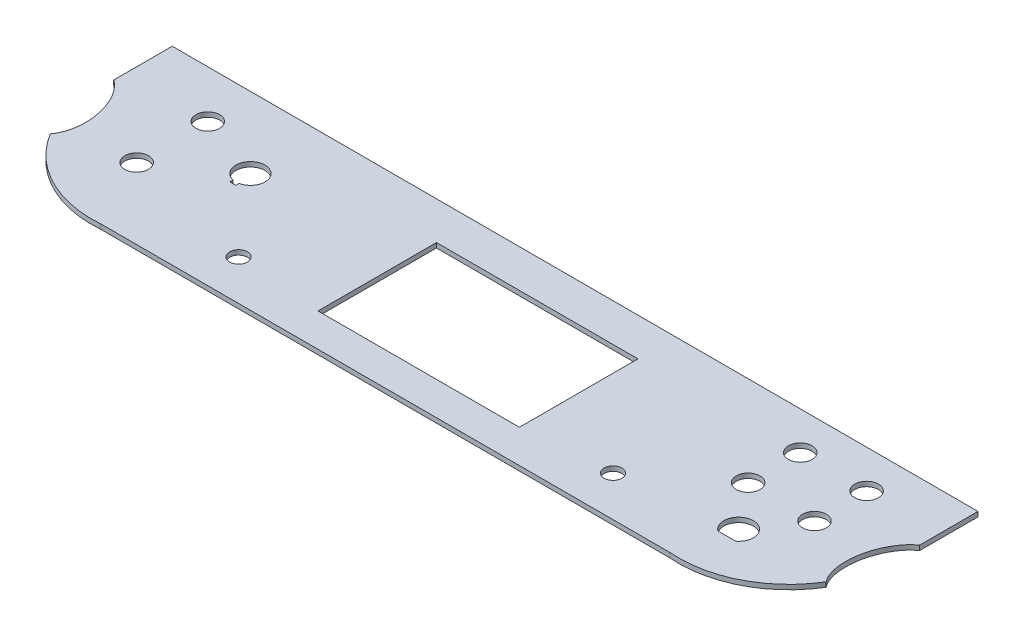
ISO-10303-21;
HEADER;
FILE_DESCRIPTION(('STEP AP214'),'2;1');
FILE_NAME('part.step','',(''),(''),'','','');
FILE_SCHEMA(('AUTOMOTIVE_DESIGN { 1 0 10303 214 1 1 1 1 }'));
ENDSEC;
DATA;
#1=APPLICATION_CONTEXT('core data for automotive mechanical design processes');
#2=APPLICATION_PROTOCOL_DEFINITION('international standard','automotive_design',2000,#1);
#3=PRODUCT_CONTEXT('',#1,'mechanical');
#4=PRODUCT('Part','Part','',(#3));
#5=PRODUCT_RELATED_PRODUCT_CATEGORY('part','',(#4));
#6=PRODUCT_DEFINITION_FORMATION('','',#4);
#7=PRODUCT_DEFINITION_CONTEXT('part definition',#1,'design');
#8=PRODUCT_DEFINITION('design','',#6,#7);
#9=PRODUCT_DEFINITION_SHAPE('','',#8);
#10=(LENGTH_UNIT() NAMED_UNIT(*) SI_UNIT(.MILLI.,.METRE.));
#11=(NAMED_UNIT(*) PLANE_ANGLE_UNIT() SI_UNIT($,.RADIAN.));
#12=(NAMED_UNIT(*) SI_UNIT($,.STERADIAN.) SOLID_ANGLE_UNIT());
#13=UNCERTAINTY_MEASURE_WITH_UNIT(LENGTH_MEASURE(1.E-05),#10,'distance_accuracy_value','');
#14=(GEOMETRIC_REPRESENTATION_CONTEXT(3) GLOBAL_UNCERTAINTY_ASSIGNED_CONTEXT((#13)) GLOBAL_UNIT_ASSIGNED_CONTEXT((#10,
#11,#12)) REPRESENTATION_CONTEXT('',''));
#15=CARTESIAN_POINT('',(0.,0.,0.));
#16=DIRECTION('',(0.,0.,1.));
#17=DIRECTION('',(1.,0.,0.));
#18=AXIS2_PLACEMENT_3D('',#15,#16,#17);
#19=CARTESIAN_POINT('',(157.295067766693,2.54,6.44379470696514));
#20=DIRECTION('',(0.,-1.,0.));
#21=DIRECTION('',(0.,0.,-1.));
#22=AXIS2_PLACEMENT_3D('',#19,#20,#21);
#23=PLANE('',#22);
#24=CARTESIAN_POINT('',(176.53,2.54,-15.8675400014012));
#25=DIRECTION('',(0.,1.,0.));
#26=DIRECTION('',(0.,0.,1.));
#27=AXIS2_PLACEMENT_3D('',#24,#25,#26);
#28=CIRCLE('',#27,6.35);
#29=CARTESIAN_POINT('',(176.53,2.54,-9.51754000140121));
#30=VERTEX_POINT('',#29);
#31=EDGE_CURVE('E222',#30,#30,#28,.T.);
#32=ORIENTED_EDGE('',*,*,#31,.F.);
#33=EDGE_LOOP('',(#32));
#34=FACE_BOUND('',#33,.T.);
#35=CARTESIAN_POINT('',(100.33,2.54,43.8224599985988));
#36=DIRECTION('',(0.,1.,0.));
#37=DIRECTION('',(0.,0.,1.));
#38=AXIS2_PLACEMENT_3D('',#35,#36,#37);
#39=CIRCLE('',#38,4.7625);
#40=CARTESIAN_POINT('',(100.33,2.54,48.5849599985988));
#41=VERTEX_POINT('',#40);
#42=EDGE_CURVE('E209',#41,#41,#39,.T.);
#43=ORIENTED_EDGE('',*,*,#42,.F.);
#44=EDGE_LOOP('',(#43));
#45=FACE_BOUND('',#44,.T.);
#46=CARTESIAN_POINT('',(140.97,2.54,-15.8675400014012));
#47=DIRECTION('',(0.,1.,0.));
#48=DIRECTION('',(0.,0.,1.));
#49=AXIS2_PLACEMENT_3D('',#46,#47,#48);
#50=CIRCLE('',#49,6.35);
#51=CARTESIAN_POINT('',(140.97,2.54,-9.51754000140121));
#52=VERTEX_POINT('',#51);
#53=EDGE_CURVE('E236',#52,#52,#50,.T.);
#54=ORIENTED_EDGE('',*,*,#53,.F.);
#55=EDGE_LOOP('',(#54));
#56=FACE_BOUND('',#55,.T.);
#57=CARTESIAN_POINT('',(140.97,2.54,12.0724599985988));
#58=DIRECTION('',(0.,1.,0.));
#59=DIRECTION('',(0.,0.,1.));
#60=AXIS2_PLACEMENT_3D('',#57,#58,#59);
#61=CIRCLE('',#60,6.35);
#62=CARTESIAN_POINT('',(140.97,2.54,18.4224599985988));
#63=VERTEX_POINT('',#62);
#64=EDGE_CURVE('E210',#63,#63,#61,.T.);
#65=ORIENTED_EDGE('',*,*,#64,.F.);
#66=EDGE_LOOP('',(#65));
#67=FACE_BOUND('',#66,.T.);
#68=DIRECTION('',(-1.,0.,0.));
#69=VECTOR('',#68,1.);
#70=CARTESIAN_POINT('',(164.7825,2.54,42.5524599985988));
#71=LINE('',#70,#69);
#72=CARTESIAN_POINT('',(164.7825,2.54,42.5524599985988));
#73=VERTEX_POINT('',#72);
#74=CARTESIAN_POINT('',(155.2575,2.54,42.5524599985988));
#75=VERTEX_POINT('',#74);
#76=EDGE_CURVE('E223',#73,#75,#71,.T.);
#77=ORIENTED_EDGE('',*,*,#76,.T.);
#78=CARTESIAN_POINT('',(160.02,2.54,36.2024599985988));
#79=DIRECTION('',(0.,1.,0.));
#80=DIRECTION('',(0.,0.,1.));
#81=AXIS2_PLACEMENT_3D('',#78,#79,#80);
#82=CIRCLE('',#81,7.9375);
#83=EDGE_CURVE('E50',#73,#75,#82,.T.);
#84=ORIENTED_EDGE('',*,*,#83,.F.);
#85=EDGE_LOOP('',(#77,#84));
#86=FACE_BOUND('',#85,.T.);
#87=CARTESIAN_POINT('',(-100.33,2.54,43.8224599985988));
#88=DIRECTION('',(0.,1.,0.));
#89=DIRECTION('',(0.,0.,1.));
#90=AXIS2_PLACEMENT_3D('',#87,#88,#89);
#91=CIRCLE('',#90,4.7625);
#92=CARTESIAN_POINT('',(-100.33,2.54,48.5849599985988));
#93=VERTEX_POINT('',#92);
#94=EDGE_CURVE('E203',#93,#93,#91,.T.);
#95=ORIENTED_EDGE('',*,*,#94,.F.);
#96=EDGE_LOOP('',(#95));
#97=FACE_BOUND('',#96,.T.);
#98=CARTESIAN_POINT('',(-171.45,2.54,27.3124599985988));
#99=DIRECTION('',(0.,1.,0.));
#100=DIRECTION('',(0.,0.,1.));
#101=AXIS2_PLACEMENT_3D('',#98,#99,#100);
#102=CIRCLE('',#101,6.35);
#103=CARTESIAN_POINT('',(-171.45,2.54,33.6624599985988));
#104=VERTEX_POINT('',#103);
#105=EDGE_CURVE('E196',#104,#104,#102,.T.);
#106=ORIENTED_EDGE('',*,*,#105,.F.);
#107=EDGE_LOOP('',(#106));
#108=FACE_BOUND('',#107,.T.);
#109=CARTESIAN_POINT('',(214.418027538609,2.54,41.5587815019127));
#110=CARTESIAN_POINT('',(214.042953761031,2.54,41.4701865422102));
#111=CARTESIAN_POINT('',(213.302178044824,2.54,41.253320200473));
#112=CARTESIAN_POINT('',(211.76152730083,2.54,40.6070019163065));
#113=CARTESIAN_POINT('',(209.825715205948,2.54,39.3668951597452));
#114=CARTESIAN_POINT('',(207.642778210324,2.54,37.0782440730854));
#115=CARTESIAN_POINT('',(205.769429419578,2.54,33.9247631860474));
#116=CARTESIAN_POINT('',(204.364219868055,2.54,29.8685261295306));
#117=CARTESIAN_POINT('',(203.602011313652,2.54,24.951147017466));
#118=CARTESIAN_POINT('',(203.646262202064,2.54,19.3690889994743));
#119=CARTESIAN_POINT('',(204.584578871518,2.54,13.4996010852786));
#120=CARTESIAN_POINT('',(206.371728131496,2.54,7.8306131624101));
#121=CARTESIAN_POINT('',(208.829838854301,2.54,2.81872514173565));
#122=CARTESIAN_POINT('',(211.711764264887,2.54,-1.23788491346954));
#123=CARTESIAN_POINT('',(214.783414722827,2.54,-4.23665739676846));
#124=CARTESIAN_POINT('',(217.869789499089,2.54,-6.21861807679074));
#125=CARTESIAN_POINT('',(220.846064988478,2.54,-7.2886283265533));
#126=CARTESIAN_POINT('',(223.132164490552,2.54,-7.53149104698141));
#127=CARTESIAN_POINT('',(224.799177514851,2.54,-7.42013748288939));
#128=CARTESIAN_POINT('',(225.938456606011,2.54,-7.21386723727985));
#129=CARTESIAN_POINT('',(227.049620180322,2.54,-6.8885677246742));
#130=CARTESIAN_POINT('',(228.590270924316,2.54,-6.24224944050763));
#131=CARTESIAN_POINT('',(230.526083019198,2.54,-5.00214268394637));
#132=CARTESIAN_POINT('',(232.709020014821,2.54,-2.71349159728655));
#133=CARTESIAN_POINT('',(234.582368805567,2.54,0.439989289751422));
#134=CARTESIAN_POINT('',(235.98757835709,2.54,4.49622634626828));
#135=CARTESIAN_POINT('',(236.749786911493,2.54,9.41360545833282));
#136=CARTESIAN_POINT('',(236.705536023082,2.54,14.9956634763246));
#137=CARTESIAN_POINT('',(235.767219353627,2.54,20.8651513905202));
#138=CARTESIAN_POINT('',(233.98007009365,2.54,26.5341393133887));
#139=CARTESIAN_POINT('',(231.521959370844,2.54,31.5460273340632));
#140=CARTESIAN_POINT('',(228.640033960258,2.54,35.6026373892684));
#141=CARTESIAN_POINT('',(225.568383502318,2.54,38.6014098725673));
#142=CARTESIAN_POINT('',(222.482008726056,2.54,40.5833705525896));
#143=CARTESIAN_POINT('',(219.505733236668,2.54,41.6533808023522));
#144=CARTESIAN_POINT('',(217.219633734593,2.54,41.8962435227803));
#145=CARTESIAN_POINT('',(215.552620710294,2.54,41.7848899586882));
#146=CARTESIAN_POINT('',(214.793101316188,2.54,41.6473764616152));
#147=CARTESIAN_POINT('',(214.418027538609,2.54,41.5587815019127));
#148=B_SPLINE_CURVE_WITH_KNOTS('',3,(#109,#110,#111,#112,#113,#114,#115,#116,#117,#118,#119,
#120,#121,#122,#123,#124,#125,#126,#127,#128,#129,#130,#131,#132,#133,#134,#135,#136,#137,#138,
#139,#140,#141,#142,#143,#144,#145,#146,#147),.UNSPECIFIED.,.T.,.F.,(4,1,1,1,1,1,1,1,1,1,1,1,1,
1,1,1,1,1,1,1,1,1,1,1,1,1,1,1,1,1,1,1,1,1,1,1,4),(0.,0.015625,0.03125,0.0625,0.09375,0.125,
0.15625,0.1875,0.21875,0.25,0.28125,0.3125,0.34375,0.375,0.40625,0.4375,0.46875,0.484375,0.5,
0.515625,0.53125,0.5625,0.59375,0.625,0.65625,0.6875,0.71875,0.75,0.78125,0.8125,0.84375,0.875,
0.90625,0.9375,0.96875,0.984375,1.),.UNSPECIFIED.);
#149=CARTESIAN_POINT('',(207.868044886352,2.54,37.162504965888));
#150=VERTEX_POINT('',#149);
#151=CARTESIAN_POINT('',(215.9,2.54,-4.90259604492799));
#152=VERTEX_POINT('',#151);
#153=EDGE_CURVE('E260',#150,#152,#148,.T.);
#154=ORIENTED_EDGE('',*,*,#153,.T.);
#155=DIRECTION('',(0.,0.,-1.));
#156=VECTOR('',#155,1.);
#157=CARTESIAN_POINT('',(215.9,2.54,14.6124599985988));
#158=LINE('',#157,#156);
#159=CARTESIAN_POINT('',(215.9,2.54,-36.1875400014012));
#160=VERTEX_POINT('',#159);
#161=EDGE_CURVE('E341',#152,#160,#158,.T.);
#162=ORIENTED_EDGE('',*,*,#161,.T.);
#163=DIRECTION('',(-1.,0.,0.));
#164=VECTOR('',#163,1.);
#165=CARTESIAN_POINT('',(215.9,2.54,-36.1875400014012));
#166=LINE('',#165,#164);
#167=CARTESIAN_POINT('',(-215.9,2.54,-36.1875400014012));
#168=VERTEX_POINT('',#167);
#169=EDGE_CURVE('E344',#160,#168,#166,.T.);
#170=ORIENTED_EDGE('',*,*,#169,.T.);
#171=DIRECTION('',(0.,0.,1.));
#172=VECTOR('',#171,1.);
#173=CARTESIAN_POINT('',(-215.9,2.54,14.6124599985989));
#174=LINE('',#173,#172);
#175=CARTESIAN_POINT('',(-215.9,2.54,-4.83511551771787));
#176=VERTEX_POINT('',#175);
#177=EDGE_CURVE('E346',#168,#176,#174,.T.);
#178=ORIENTED_EDGE('',*,*,#177,.T.);
#179=CARTESIAN_POINT('',(-226.051095403651,2.54,-7.19009506758158));
#180=CARTESIAN_POINT('',(-225.676136672233,2.54,-7.27930316383618));
#181=CARTESIAN_POINT('',(-224.916780090115,2.54,-7.41804492834545));
#182=CARTESIAN_POINT('',(-223.249816640437,2.54,-7.53203329540893));
#183=CARTESIAN_POINT('',(-220.963170707042,2.54,-7.29266166075755));
#184=CARTESIAN_POINT('',(-217.985054135841,2.54,-6.22702519844932));
#185=CARTESIAN_POINT('',(-214.895413966226,2.54,-4.24945720199778));
#186=CARTESIAN_POINT('',(-211.818837240113,2.54,-1.25488504557534));
#187=CARTESIAN_POINT('',(-208.930212320968,2.54,2.79802161572746));
#188=CARTESIAN_POINT('',(-206.463783195008,2.54,7.80706622394607));
#189=CARTESIAN_POINT('',(-204.667192604217,2.54,13.4743988237215));
#190=CARTESIAN_POINT('',(-203.719076256733,2.54,19.3435956971471));
#191=CARTESIAN_POINT('',(-203.665482887654,2.54,24.9266887709995));
#192=CARTESIAN_POINT('',(-204.419435916413,2.54,29.8462173214975));
#193=CARTESIAN_POINT('',(-205.81781173939,2.54,33.905445303441));
#194=CARTESIAN_POINT('',(-207.685847242087,2.54,37.0625159264945));
#195=CARTESIAN_POINT('',(-209.864985661102,2.54,39.3551378168715));
#196=CARTESIAN_POINT('',(-211.798837632187,2.54,40.5986268430062));
#197=CARTESIAN_POINT('',(-213.338532650553,2.54,41.2475488266133));
#198=CARTESIAN_POINT('',(-214.449250165883,2.54,41.574684757377));
#199=CARTESIAN_POINT('',(-215.58828503906,2.54,41.7827974041409));
#200=CARTESIAN_POINT('',(-217.255248488738,2.54,41.8967857712044));
#201=CARTESIAN_POINT('',(-219.541894422133,2.54,41.657414136553));
#202=CARTESIAN_POINT('',(-222.520010993335,2.54,40.5917776742448));
#203=CARTESIAN_POINT('',(-225.609651162949,2.54,38.6142096777932));
#204=CARTESIAN_POINT('',(-228.686227889062,2.54,35.6196375213708));
#205=CARTESIAN_POINT('',(-231.574852808207,2.54,31.566730860068));
#206=CARTESIAN_POINT('',(-234.041281934167,2.54,26.5576862518494));
#207=CARTESIAN_POINT('',(-235.837872524958,2.54,20.890353652074));
#208=CARTESIAN_POINT('',(-236.785988872442,2.54,15.0211567786483));
#209=CARTESIAN_POINT('',(-236.839582241521,2.54,9.43806370479598));
#210=CARTESIAN_POINT('',(-236.085629212762,2.54,4.51853515429797));
#211=CARTESIAN_POINT('',(-234.687253389785,2.54,0.459307172354426));
#212=CARTESIAN_POINT('',(-232.819217887088,2.54,-2.69776345069913));
#213=CARTESIAN_POINT('',(-230.640079468073,2.54,-4.99038534107605));
#214=CARTESIAN_POINT('',(-228.706227496988,2.54,-6.23387436721082));
#215=CARTESIAN_POINT('',(-227.166532478622,2.54,-6.88279635081786));
#216=CARTESIAN_POINT('',(-226.426054135069,2.54,-7.10088697132698));
#217=CARTESIAN_POINT('',(-226.051095403651,2.54,-7.19009506758158));
#218=B_SPLINE_CURVE_WITH_KNOTS('',3,(#179,#180,#181,#182,#183,#184,#185,#186,#187,#188,#189,
#190,#191,#192,#193,#194,#195,#196,#197,#198,#199,#200,#201,#202,#203,#204,#205,#206,#207,#208,
#209,#210,#211,#212,#213,#214,#215,#216,#217),.UNSPECIFIED.,.T.,.F.,(4,1,1,1,1,1,1,1,1,1,1,1,1,
1,1,1,1,1,1,1,1,1,1,1,1,1,1,1,1,1,1,1,1,1,1,1,4),(0.,0.015625,0.03125,0.0625,0.09375,0.125,
0.15625,0.1875,0.21875,0.25,0.28125,0.3125,0.34375,0.375,0.40625,0.4375,0.46875,0.484375,0.5,
0.515625,0.53125,0.5625,0.59375,0.625,0.65625,0.6875,0.71875,0.75,0.78125,0.8125,0.84375,0.875,
0.90625,0.9375,0.96875,0.984375,1.),.UNSPECIFIED.);
#219=CARTESIAN_POINT('',(-207.892164085101,2.54,37.1227617505761));
#220=VERTEX_POINT('',#219);
#221=EDGE_CURVE('E249',#176,#220,#218,.T.);
#222=ORIENTED_EDGE('',*,*,#221,.T.);
#223=CARTESIAN_POINT('',(-157.295067766693,2.54,6.44379470696514));
#224=DIRECTION('',(0.,1.,0.));
#225=DIRECTION('',(0.,0.,-1.));
#226=AXIS2_PLACEMENT_3D('',#223,#224,#225);
#227=CIRCLE('',#226,59.17148954283);
#228=CARTESIAN_POINT('',(-152.4,2.54,65.4124599985988));
#229=VERTEX_POINT('',#228);
#230=EDGE_CURVE('E349',#220,#229,#227,.T.);
#231=ORIENTED_EDGE('',*,*,#230,.T.);
#232=DIRECTION('',(1.,0.,0.));
#233=VECTOR('',#232,1.);
#234=CARTESIAN_POINT('',(152.4,2.54,65.4124599985988));
#235=LINE('',#234,#233);
#236=CARTESIAN_POINT('',(152.4,2.54,65.4124599985988));
#237=VERTEX_POINT('',#236);
#238=EDGE_CURVE('E351',#229,#237,#235,.T.);
#239=ORIENTED_EDGE('',*,*,#238,.T.);
#240=CARTESIAN_POINT('',(157.295067766693,2.54,6.44379470696514));
#241=DIRECTION('',(0.,1.,0.));
#242=DIRECTION('',(0.,0.,-1.));
#243=AXIS2_PLACEMENT_3D('',#240,#241,#242);
#244=CIRCLE('',#243,59.17148954283);
#245=EDGE_CURVE('E338',#237,#150,#244,.T.);
#246=ORIENTED_EDGE('',*,*,#245,.T.);
#247=EDGE_LOOP('',(#154,#162,#170,#178,#222,#231,#239,#246));
#248=FACE_BOUND('',#247,.T.);
#249=DIRECTION('',(1.,0.,0.));
#250=VECTOR('',#249,1.);
#251=CARTESIAN_POINT('',(53.9749999999999,2.54,47.625));
#252=LINE('',#251,#250);
#253=CARTESIAN_POINT('',(-53.9750000000001,2.54,47.625));
#254=VERTEX_POINT('',#253);
#255=CARTESIAN_POINT('',(53.9749999999999,2.54,47.625));
#256=VERTEX_POINT('',#255);
#257=EDGE_CURVE('E320',#254,#256,#252,.T.);
#258=ORIENTED_EDGE('',*,*,#257,.F.);
#259=DIRECTION('',(0.,0.,1.));
#260=VECTOR('',#259,1.);
#261=CARTESIAN_POINT('',(-53.9750000000001,2.54,47.625));
#262=LINE('',#261,#260);
#263=CARTESIAN_POINT('',(-53.9750000000001,2.54,-15.875));
#264=VERTEX_POINT('',#263);
#265=EDGE_CURVE('E318',#264,#254,#262,.T.);
#266=ORIENTED_EDGE('',*,*,#265,.F.);
#267=DIRECTION('',(-1.,0.,0.));
#268=VECTOR('',#267,1.);
#269=CARTESIAN_POINT('',(53.9749999999999,2.54,-15.875));
#270=LINE('',#269,#268);
#271=CARTESIAN_POINT('',(53.9749999999999,2.54,-15.875));
#272=VERTEX_POINT('',#271);
#273=EDGE_CURVE('E308',#272,#264,#270,.T.);
#274=ORIENTED_EDGE('',*,*,#273,.F.);
#275=DIRECTION('',(0.,0.,-1.));
#276=VECTOR('',#275,1.);
#277=CARTESIAN_POINT('',(53.9749999999999,2.54,47.625));
#278=LINE('',#277,#276);
#279=EDGE_CURVE('E324',#256,#272,#278,.T.);
#280=ORIENTED_EDGE('',*,*,#279,.F.);
#281=EDGE_LOOP('',(#258,#266,#274,#280));
#282=FACE_BOUND('',#281,.T.);
#283=CARTESIAN_POINT('',(176.53,2.54,12.0724599985988));
#284=DIRECTION('',(0.,1.,0.));
#285=DIRECTION('',(0.,0.,1.));
#286=AXIS2_PLACEMENT_3D('',#283,#284,#285);
#287=CIRCLE('',#286,6.35);
#288=CARTESIAN_POINT('',(176.53,2.54,18.4224599985988));
#289=VERTEX_POINT('',#288);
#290=EDGE_CURVE('E250',#289,#289,#287,.T.);
#291=ORIENTED_EDGE('',*,*,#290,.F.);
#292=EDGE_LOOP('',(#291));
#293=FACE_BOUND('',#292,.T.);
#294=CARTESIAN_POINT('',(-171.45,2.54,-10.7875400014012));
#295=DIRECTION('',(0.,1.,0.));
#296=DIRECTION('',(0.,0.,1.));
#297=AXIS2_PLACEMENT_3D('',#294,#295,#296);
#298=CIRCLE('',#297,6.35);
#299=CARTESIAN_POINT('',(-171.45,2.54,-4.43754000140121));
#300=VERTEX_POINT('',#299);
#301=EDGE_CURVE('E253',#300,#300,#298,.T.);
#302=ORIENTED_EDGE('',*,*,#301,.F.);
#303=EDGE_LOOP('',(#302));
#304=FACE_BOUND('',#303,.T.);
#305=DIRECTION('',(0.,0.,1.));
#306=VECTOR('',#305,1.);
#307=CARTESIAN_POINT('',(-134.3025,2.54,9.55992716099969));
#308=LINE('',#307,#306);
#309=CARTESIAN_POINT('',(-134.3025,2.54,9.5599271609997));
#310=VERTEX_POINT('',#309);
#311=CARTESIAN_POINT('',(-134.3025,2.54,11.3379271609997));
#312=VERTEX_POINT('',#311);
#313=EDGE_CURVE('E58',#310,#312,#308,.T.);
#314=ORIENTED_EDGE('',*,*,#313,.T.);
#315=DIRECTION('',(-1.,0.,0.));
#316=VECTOR('',#315,1.);
#317=CARTESIAN_POINT('',(-134.3025,2.54,11.3379271609997));
#318=LINE('',#317,#316);
#319=CARTESIAN_POINT('',(-137.4775,2.54,11.3379271609997));
#320=VERTEX_POINT('',#319);
#321=EDGE_CURVE('E183',#312,#320,#318,.T.);
#322=ORIENTED_EDGE('',*,*,#321,.T.);
#323=DIRECTION('',(0.,0.,-1.));
#324=VECTOR('',#323,1.);
#325=CARTESIAN_POINT('',(-137.4775,2.54,11.3379271609997));
#326=LINE('',#325,#324);
#327=CARTESIAN_POINT('',(-137.4775,2.54,9.55992716099968));
#328=VERTEX_POINT('',#327);
#329=EDGE_CURVE('E167',#320,#328,#326,.T.);
#330=ORIENTED_EDGE('',*,*,#329,.T.);
#331=CARTESIAN_POINT('',(-135.89,2.54,1.9124599985988));
#332=DIRECTION('',(0.,1.,0.));
#333=DIRECTION('',(0.,0.,1.));
#334=AXIS2_PLACEMENT_3D('',#331,#332,#333);
#335=CIRCLE('',#334,7.81049999999999);
#336=EDGE_CURVE('E178',#310,#328,#335,.T.);
#337=ORIENTED_EDGE('',*,*,#336,.F.);
#338=EDGE_LOOP('',(#314,#322,#330,#337));
#339=FACE_BOUND('',#338,.T.);
#340=ADVANCED_FACE('F35',(#34,#45,#56,#67,#86,#97,#108,#248,#282,#293,#304,#339),#23,.F.);
#341=CARTESIAN_POINT('',(157.295067766693,0.,6.44379470696514));
#342=DIRECTION('',(0.,-1.,0.));
#343=DIRECTION('',(0.,0.,-1.));
#344=AXIS2_PLACEMENT_3D('',#341,#342,#343);
#345=PLANE('',#344);
#346=CARTESIAN_POINT('',(176.53,0.,-15.8675400014012));
#347=DIRECTION('',(0.,1.,0.));
#348=DIRECTION('',(0.,0.,1.));
#349=AXIS2_PLACEMENT_3D('',#346,#347,#348);
#350=CIRCLE('',#349,6.35);
#351=CARTESIAN_POINT('',(176.53,0.,-9.51754000140121));
#352=VERTEX_POINT('',#351);
#353=EDGE_CURVE('E243',#352,#352,#350,.T.);
#354=ORIENTED_EDGE('',*,*,#353,.T.);
#355=EDGE_LOOP('',(#354));
#356=FACE_BOUND('',#355,.T.);
#357=CARTESIAN_POINT('',(100.33,0.,43.8224599985988));
#358=DIRECTION('',(0.,1.,0.));
#359=DIRECTION('',(0.,0.,1.));
#360=AXIS2_PLACEMENT_3D('',#357,#358,#359);
#361=CIRCLE('',#360,4.7625);
#362=CARTESIAN_POINT('',(100.33,0.,48.5849599985988));
#363=VERTEX_POINT('',#362);
#364=EDGE_CURVE('E233',#363,#363,#361,.T.);
#365=ORIENTED_EDGE('',*,*,#364,.T.);
#366=EDGE_LOOP('',(#365));
#367=FACE_BOUND('',#366,.T.);
#368=CARTESIAN_POINT('',(140.97,0.,-15.8675400014012));
#369=DIRECTION('',(0.,1.,0.));
#370=DIRECTION('',(0.,0.,1.));
#371=AXIS2_PLACEMENT_3D('',#368,#369,#370);
#372=CIRCLE('',#371,6.35);
#373=CARTESIAN_POINT('',(140.97,0.,-9.51754000140121));
#374=VERTEX_POINT('',#373);
#375=EDGE_CURVE('E213',#374,#374,#372,.T.);
#376=ORIENTED_EDGE('',*,*,#375,.T.);
#377=EDGE_LOOP('',(#376));
#378=FACE_BOUND('',#377,.T.);
#379=CARTESIAN_POINT('',(140.97,0.,12.0724599985988));
#380=DIRECTION('',(0.,1.,0.));
#381=DIRECTION('',(0.,0.,1.));
#382=AXIS2_PLACEMENT_3D('',#379,#380,#381);
#383=CIRCLE('',#382,6.35);
#384=CARTESIAN_POINT('',(140.97,0.,18.4224599985988));
#385=VERTEX_POINT('',#384);
#386=EDGE_CURVE('E214',#385,#385,#383,.T.);
#387=ORIENTED_EDGE('',*,*,#386,.T.);
#388=EDGE_LOOP('',(#387));
#389=FACE_BOUND('',#388,.T.);
#390=CARTESIAN_POINT('',(160.02,0.,36.2024599985988));
#391=DIRECTION('',(0.,1.,0.));
#392=DIRECTION('',(0.,0.,1.));
#393=AXIS2_PLACEMENT_3D('',#390,#391,#392);
#394=CIRCLE('',#393,7.9375);
#395=CARTESIAN_POINT('',(164.7825,0.,42.5524599985988));
#396=VERTEX_POINT('',#395);
#397=CARTESIAN_POINT('',(155.2575,0.,42.5524599985988));
#398=VERTEX_POINT('',#397);
#399=EDGE_CURVE('E226',#396,#398,#394,.T.);
#400=ORIENTED_EDGE('',*,*,#399,.T.);
#401=DIRECTION('',(-1.,0.,0.));
#402=VECTOR('',#401,1.);
#403=CARTESIAN_POINT('',(164.7825,0.,42.5524599985988));
#404=LINE('',#403,#402);
#405=EDGE_CURVE('E219',#396,#398,#404,.T.);
#406=ORIENTED_EDGE('',*,*,#405,.F.);
#407=EDGE_LOOP('',(#400,#406));
#408=FACE_BOUND('',#407,.T.);
#409=CARTESIAN_POINT('',(-100.33,0.,43.8224599985988));
#410=DIRECTION('',(0.,1.,0.));
#411=DIRECTION('',(0.,0.,1.));
#412=AXIS2_PLACEMENT_3D('',#409,#410,#411);
#413=CIRCLE('',#412,4.7625);
#414=CARTESIAN_POINT('',(-100.33,0.,48.5849599985988));
#415=VERTEX_POINT('',#414);
#416=EDGE_CURVE('E206',#415,#415,#413,.T.);
#417=ORIENTED_EDGE('',*,*,#416,.T.);
#418=EDGE_LOOP('',(#417));
#419=FACE_BOUND('',#418,.T.);
#420=CARTESIAN_POINT('',(-171.45,0.,27.3124599985988));
#421=DIRECTION('',(0.,1.,0.));
#422=DIRECTION('',(0.,0.,1.));
#423=AXIS2_PLACEMENT_3D('',#420,#421,#422);
#424=CIRCLE('',#423,6.35);
#425=CARTESIAN_POINT('',(-171.45,0.,33.6624599985988));
#426=VERTEX_POINT('',#425);
#427=EDGE_CURVE('E200',#426,#426,#424,.T.);
#428=ORIENTED_EDGE('',*,*,#427,.T.);
#429=EDGE_LOOP('',(#428));
#430=FACE_BOUND('',#429,.T.);
#431=CARTESIAN_POINT('',(-171.45,0.,-10.7875400014012));
#432=DIRECTION('',(0.,1.,0.));
#433=DIRECTION('',(0.,0.,1.));
#434=AXIS2_PLACEMENT_3D('',#431,#432,#433);
#435=CIRCLE('',#434,6.35);
#436=CARTESIAN_POINT('',(-171.45,0.,-4.43754000140121));
#437=VERTEX_POINT('',#436);
#438=EDGE_CURVE('E189',#437,#437,#435,.T.);
#439=ORIENTED_EDGE('',*,*,#438,.T.);
#440=EDGE_LOOP('',(#439));
#441=FACE_BOUND('',#440,.T.);
#442=CARTESIAN_POINT('',(176.53,0.,12.0724599985988));
#443=DIRECTION('',(0.,1.,0.));
#444=DIRECTION('',(0.,0.,1.));
#445=AXIS2_PLACEMENT_3D('',#442,#443,#444);
#446=CIRCLE('',#445,6.35);
#447=CARTESIAN_POINT('',(176.53,0.,18.4224599985988));
#448=VERTEX_POINT('',#447);
#449=EDGE_CURVE('E246',#448,#448,#446,.T.);
#450=ORIENTED_EDGE('',*,*,#449,.T.);
#451=EDGE_LOOP('',(#450));
#452=FACE_BOUND('',#451,.T.);
#453=DIRECTION('',(0.,0.,1.));
#454=VECTOR('',#453,1.);
#455=CARTESIAN_POINT('',(-53.9750000000001,0.,47.625));
#456=LINE('',#455,#454);
#457=CARTESIAN_POINT('',(-53.9750000000001,0.,-15.875));
#458=VERTEX_POINT('',#457);
#459=CARTESIAN_POINT('',(-53.9750000000001,0.,47.625));
#460=VERTEX_POINT('',#459);
#461=EDGE_CURVE('E304',#458,#460,#456,.T.);
#462=ORIENTED_EDGE('',*,*,#461,.T.);
#463=DIRECTION('',(1.,0.,0.));
#464=VECTOR('',#463,1.);
#465=CARTESIAN_POINT('',(53.9749999999999,0.,47.625));
#466=LINE('',#465,#464);
#467=CARTESIAN_POINT('',(53.9749999999999,0.,47.625));
#468=VERTEX_POINT('',#467);
#469=EDGE_CURVE('E307',#460,#468,#466,.T.);
#470=ORIENTED_EDGE('',*,*,#469,.T.);
#471=DIRECTION('',(0.,0.,-1.));
#472=VECTOR('',#471,1.);
#473=CARTESIAN_POINT('',(53.9749999999999,0.,47.625));
#474=LINE('',#473,#472);
#475=CARTESIAN_POINT('',(53.9749999999999,0.,-15.875));
#476=VERTEX_POINT('',#475);
#477=EDGE_CURVE('E311',#468,#476,#474,.T.);
#478=ORIENTED_EDGE('',*,*,#477,.T.);
#479=DIRECTION('',(-1.,0.,0.));
#480=VECTOR('',#479,1.);
#481=CARTESIAN_POINT('',(53.9749999999999,0.,-15.875));
#482=LINE('',#481,#480);
#483=EDGE_CURVE('E314',#476,#458,#482,.T.);
#484=ORIENTED_EDGE('',*,*,#483,.T.);
#485=EDGE_LOOP('',(#462,#470,#478,#484));
#486=FACE_BOUND('',#485,.T.);
#487=DIRECTION('',(0.,0.,-1.));
#488=VECTOR('',#487,1.);
#489=CARTESIAN_POINT('',(215.9,0.,14.6124599985988));
#490=LINE('',#489,#488);
#491=CARTESIAN_POINT('',(215.9,0.,-4.90259604492799));
#492=VERTEX_POINT('',#491);
#493=CARTESIAN_POINT('',(215.9,0.,-36.1875400014012));
#494=VERTEX_POINT('',#493);
#495=EDGE_CURVE('E356',#492,#494,#490,.T.);
#496=ORIENTED_EDGE('',*,*,#495,.F.);
#497=CARTESIAN_POINT('',(214.418027538609,0.,41.5587815019127));
#498=CARTESIAN_POINT('',(214.042953761031,0.,41.4701865422102));
#499=CARTESIAN_POINT('',(213.302178044824,0.,41.253320200473));
#500=CARTESIAN_POINT('',(211.76152730083,0.,40.6070019163065));
#501=CARTESIAN_POINT('',(209.825715205948,0.,39.3668951597452));
#502=CARTESIAN_POINT('',(207.642778210324,0.,37.0782440730854));
#503=CARTESIAN_POINT('',(205.769429419578,0.,33.9247631860474));
#504=CARTESIAN_POINT('',(204.364219868055,0.,29.8685261295306));
#505=CARTESIAN_POINT('',(203.602011313652,0.,24.951147017466));
#506=CARTESIAN_POINT('',(203.646262202064,0.,19.3690889994743));
#507=CARTESIAN_POINT('',(204.584578871518,0.,13.4996010852786));
#508=CARTESIAN_POINT('',(206.371728131496,0.,7.8306131624101));
#509=CARTESIAN_POINT('',(208.829838854301,0.,2.81872514173565));
#510=CARTESIAN_POINT('',(211.711764264887,0.,-1.23788491346954));
#511=CARTESIAN_POINT('',(214.783414722827,0.,-4.23665739676846));
#512=CARTESIAN_POINT('',(217.869789499089,0.,-6.21861807679074));
#513=CARTESIAN_POINT('',(220.846064988478,0.,-7.2886283265533));
#514=CARTESIAN_POINT('',(223.132164490552,0.,-7.53149104698141));
#515=CARTESIAN_POINT('',(224.799177514851,0.,-7.42013748288939));
#516=CARTESIAN_POINT('',(225.938456606011,0.,-7.21386723727985));
#517=CARTESIAN_POINT('',(227.049620180322,0.,-6.8885677246742));
#518=CARTESIAN_POINT('',(228.590270924316,0.,-6.24224944050763));
#519=CARTESIAN_POINT('',(230.526083019198,0.,-5.00214268394637));
#520=CARTESIAN_POINT('',(232.709020014821,0.,-2.71349159728655));
#521=CARTESIAN_POINT('',(234.582368805567,0.,0.439989289751422));
#522=CARTESIAN_POINT('',(235.98757835709,0.,4.49622634626828));
#523=CARTESIAN_POINT('',(236.749786911493,0.,9.41360545833282));
#524=CARTESIAN_POINT('',(236.705536023082,0.,14.9956634763246));
#525=CARTESIAN_POINT('',(235.767219353627,0.,20.8651513905202));
#526=CARTESIAN_POINT('',(233.98007009365,0.,26.5341393133887));
#527=CARTESIAN_POINT('',(231.521959370844,0.,31.5460273340632));
#528=CARTESIAN_POINT('',(228.640033960258,0.,35.6026373892684));
#529=CARTESIAN_POINT('',(225.568383502318,0.,38.6014098725673));
#530=CARTESIAN_POINT('',(222.482008726056,0.,40.5833705525896));
#531=CARTESIAN_POINT('',(219.505733236668,0.,41.6533808023522));
#532=CARTESIAN_POINT('',(217.219633734593,0.,41.8962435227803));
#533=CARTESIAN_POINT('',(215.552620710294,0.,41.7848899586882));
#534=CARTESIAN_POINT('',(214.793101316188,0.,41.6473764616152));
#535=CARTESIAN_POINT('',(214.418027538609,0.,41.5587815019127));
#536=B_SPLINE_CURVE_WITH_KNOTS('',3,(#497,#498,#499,#500,#501,#502,#503,#504,#505,#506,#507,
#508,#509,#510,#511,#512,#513,#514,#515,#516,#517,#518,#519,#520,#521,#522,#523,#524,#525,#526,
#527,#528,#529,#530,#531,#532,#533,#534,#535),.UNSPECIFIED.,.T.,.F.,(4,1,1,1,1,1,1,1,1,1,1,1,1,
1,1,1,1,1,1,1,1,1,1,1,1,1,1,1,1,1,1,1,1,1,1,1,4),(0.,0.015625,0.03125,0.0625,0.09375,0.125,
0.15625,0.1875,0.21875,0.25,0.28125,0.3125,0.34375,0.375,0.40625,0.4375,0.46875,0.484375,0.5,
0.515625,0.53125,0.5625,0.59375,0.625,0.65625,0.6875,0.71875,0.75,0.78125,0.8125,0.84375,0.875,
0.90625,0.9375,0.96875,0.984375,1.),.UNSPECIFIED.);
#537=CARTESIAN_POINT('',(207.868044886352,0.,37.162504965888));
#538=VERTEX_POINT('',#537);
#539=EDGE_CURVE('E254',#538,#492,#536,.T.);
#540=ORIENTED_EDGE('',*,*,#539,.F.);
#541=CARTESIAN_POINT('',(157.295067766693,0.,6.44379470696514));
#542=DIRECTION('',(0.,1.,0.));
#543=DIRECTION('',(0.,0.,-1.));
#544=AXIS2_PLACEMENT_3D('',#541,#542,#543);
#545=CIRCLE('',#544,59.17148954283);
#546=CARTESIAN_POINT('',(152.4,0.,65.4124599985988));
#547=VERTEX_POINT('',#546);
#548=EDGE_CURVE('E331',#547,#538,#545,.T.);
#549=ORIENTED_EDGE('',*,*,#548,.F.);
#550=DIRECTION('',(1.,0.,0.));
#551=VECTOR('',#550,1.);
#552=CARTESIAN_POINT('',(152.4,0.,65.4124599985988));
#553=LINE('',#552,#551);
#554=CARTESIAN_POINT('',(-152.4,0.,65.4124599985988));
#555=VERTEX_POINT('',#554);
#556=EDGE_CURVE('E342',#555,#547,#553,.T.);
#557=ORIENTED_EDGE('',*,*,#556,.F.);
#558=CARTESIAN_POINT('',(-157.295067766693,0.,6.44379470696514));
#559=DIRECTION('',(0.,1.,0.));
#560=DIRECTION('',(0.,0.,-1.));
#561=AXIS2_PLACEMENT_3D('',#558,#559,#560);
#562=CIRCLE('',#561,59.17148954283);
#563=CARTESIAN_POINT('',(-207.892164085101,0.,37.1227617505761));
#564=VERTEX_POINT('',#563);
#565=EDGE_CURVE('E363',#564,#555,#562,.T.);
#566=ORIENTED_EDGE('',*,*,#565,.F.);
#567=CARTESIAN_POINT('',(-226.051095403651,0.,-7.19009506758158));
#568=CARTESIAN_POINT('',(-225.676136672233,0.,-7.27930316383618));
#569=CARTESIAN_POINT('',(-224.916780090115,0.,-7.41804492834545));
#570=CARTESIAN_POINT('',(-223.249816640437,0.,-7.53203329540893));
#571=CARTESIAN_POINT('',(-220.963170707042,0.,-7.29266166075755));
#572=CARTESIAN_POINT('',(-217.985054135841,0.,-6.22702519844932));
#573=CARTESIAN_POINT('',(-214.895413966226,0.,-4.24945720199778));
#574=CARTESIAN_POINT('',(-211.818837240113,0.,-1.25488504557534));
#575=CARTESIAN_POINT('',(-208.930212320968,0.,2.79802161572746));
#576=CARTESIAN_POINT('',(-206.463783195008,0.,7.80706622394607));
#577=CARTESIAN_POINT('',(-204.667192604217,0.,13.4743988237215));
#578=CARTESIAN_POINT('',(-203.719076256733,0.,19.3435956971471));
#579=CARTESIAN_POINT('',(-203.665482887654,0.,24.9266887709995));
#580=CARTESIAN_POINT('',(-204.419435916413,0.,29.8462173214975));
#581=CARTESIAN_POINT('',(-205.81781173939,0.,33.905445303441));
#582=CARTESIAN_POINT('',(-207.685847242087,0.,37.0625159264945));
#583=CARTESIAN_POINT('',(-209.864985661102,0.,39.3551378168715));
#584=CARTESIAN_POINT('',(-211.798837632187,0.,40.5986268430062));
#585=CARTESIAN_POINT('',(-213.338532650553,0.,41.2475488266133));
#586=CARTESIAN_POINT('',(-214.449250165883,0.,41.574684757377));
#587=CARTESIAN_POINT('',(-215.58828503906,0.,41.7827974041409));
#588=CARTESIAN_POINT('',(-217.255248488738,0.,41.8967857712044));
#589=CARTESIAN_POINT('',(-219.541894422133,0.,41.657414136553));
#590=CARTESIAN_POINT('',(-222.520010993335,0.,40.5917776742448));
#591=CARTESIAN_POINT('',(-225.609651162949,0.,38.6142096777932));
#592=CARTESIAN_POINT('',(-228.686227889062,0.,35.6196375213708));
#593=CARTESIAN_POINT('',(-231.574852808207,0.,31.566730860068));
#594=CARTESIAN_POINT('',(-234.041281934167,0.,26.5576862518494));
#595=CARTESIAN_POINT('',(-235.837872524958,0.,20.890353652074));
#596=CARTESIAN_POINT('',(-236.785988872442,0.,15.0211567786483));
#597=CARTESIAN_POINT('',(-236.839582241521,0.,9.43806370479598));
#598=CARTESIAN_POINT('',(-236.085629212762,0.,4.51853515429797));
#599=CARTESIAN_POINT('',(-234.687253389785,0.,0.459307172354426));
#600=CARTESIAN_POINT('',(-232.819217887088,0.,-2.69776345069913));
#601=CARTESIAN_POINT('',(-230.640079468073,0.,-4.99038534107605));
#602=CARTESIAN_POINT('',(-228.706227496988,0.,-6.23387436721082));
#603=CARTESIAN_POINT('',(-227.166532478622,0.,-6.88279635081786));
#604=CARTESIAN_POINT('',(-226.426054135069,0.,-7.10088697132698));
#605=CARTESIAN_POINT('',(-226.051095403651,0.,-7.19009506758158));
#606=B_SPLINE_CURVE_WITH_KNOTS('',3,(#567,#568,#569,#570,#571,#572,#573,#574,#575,#576,#577,
#578,#579,#580,#581,#582,#583,#584,#585,#586,#587,#588,#589,#590,#591,#592,#593,#594,#595,#596,
#597,#598,#599,#600,#601,#602,#603,#604,#605),.UNSPECIFIED.,.T.,.F.,(4,1,1,1,1,1,1,1,1,1,1,1,1,
1,1,1,1,1,1,1,1,1,1,1,1,1,1,1,1,1,1,1,1,1,1,1,4),(0.,0.015625,0.03125,0.0625,0.09375,0.125,
0.15625,0.1875,0.21875,0.25,0.28125,0.3125,0.34375,0.375,0.40625,0.4375,0.46875,0.484375,0.5,
0.515625,0.53125,0.5625,0.59375,0.625,0.65625,0.6875,0.71875,0.75,0.78125,0.8125,0.84375,0.875,
0.90625,0.9375,0.96875,0.984375,1.),.UNSPECIFIED.);
#607=CARTESIAN_POINT('',(-215.9,0.,-4.83511551771787));
#608=VERTEX_POINT('',#607);
#609=EDGE_CURVE('E283',#608,#564,#606,.T.);
#610=ORIENTED_EDGE('',*,*,#609,.F.);
#611=DIRECTION('',(0.,0.,1.));
#612=VECTOR('',#611,1.);
#613=CARTESIAN_POINT('',(-215.9,0.,14.6124599985989));
#614=LINE('',#613,#612);
#615=CARTESIAN_POINT('',(-215.9,0.,-36.1875400014012));
#616=VERTEX_POINT('',#615);
#617=EDGE_CURVE('E360',#616,#608,#614,.T.);
#618=ORIENTED_EDGE('',*,*,#617,.F.);
#619=DIRECTION('',(-1.,0.,0.));
#620=VECTOR('',#619,1.);
#621=CARTESIAN_POINT('',(215.9,0.,-36.1875400014012));
#622=LINE('',#621,#620);
#623=EDGE_CURVE('E358',#494,#616,#622,.T.);
#624=ORIENTED_EDGE('',*,*,#623,.F.);
#625=EDGE_LOOP('',(#496,#540,#549,#557,#566,#610,#618,#624));
#626=FACE_BOUND('',#625,.T.);
#627=DIRECTION('',(-1.,0.,0.));
#628=VECTOR('',#627,1.);
#629=CARTESIAN_POINT('',(-134.3025,0.,11.3379271609997));
#630=LINE('',#629,#628);
#631=CARTESIAN_POINT('',(-134.3025,0.,11.3379271609997));
#632=VERTEX_POINT('',#631);
#633=CARTESIAN_POINT('',(-137.4775,0.,11.3379271609997));
#634=VERTEX_POINT('',#633);
#635=EDGE_CURVE('E193',#632,#634,#630,.T.);
#636=ORIENTED_EDGE('',*,*,#635,.F.);
#637=DIRECTION('',(0.,0.,1.));
#638=VECTOR('',#637,1.);
#639=CARTESIAN_POINT('',(-134.3025,0.,9.55992716099969));
#640=LINE('',#639,#638);
#641=CARTESIAN_POINT('',(-134.3025,0.,9.5599271609997));
#642=VERTEX_POINT('',#641);
#643=EDGE_CURVE('E181',#642,#632,#640,.T.);
#644=ORIENTED_EDGE('',*,*,#643,.F.);
#645=CARTESIAN_POINT('',(-135.89,0.,1.9124599985988));
#646=DIRECTION('',(0.,1.,0.));
#647=DIRECTION('',(0.,0.,1.));
#648=AXIS2_PLACEMENT_3D('',#645,#646,#647);
#649=CIRCLE('',#648,7.81049999999999);
#650=CARTESIAN_POINT('',(-137.4775,0.,9.55992716099968));
#651=VERTEX_POINT('',#650);
#652=EDGE_CURVE('E190',#642,#651,#649,.T.);
#653=ORIENTED_EDGE('',*,*,#652,.T.);
#654=DIRECTION('',(0.,0.,-1.));
#655=VECTOR('',#654,1.);
#656=CARTESIAN_POINT('',(-137.4775,0.,11.3379271609997));
#657=LINE('',#656,#655);
#658=EDGE_CURVE('E170',#634,#651,#657,.T.);
#659=ORIENTED_EDGE('',*,*,#658,.F.);
#660=EDGE_LOOP('',(#636,#644,#653,#659));
#661=FACE_BOUND('',#660,.T.);
#662=ADVANCED_FACE('F382',(#356,#367,#378,#389,#408,#419,#430,#441,#452,#486,#626,#661),#345,.T.);
#663=CARTESIAN_POINT('',(157.295067766693,2.54,6.44379470696514));
#664=DIRECTION('',(0.,-1.,0.));
#665=DIRECTION('',(0.,0.,-1.));
#666=AXIS2_PLACEMENT_3D('',#663,#664,#665);
#667=CYLINDRICAL_SURFACE('',#666,59.17148954283);
#668=DIRECTION('',(0.,1.,0.));
#669=VECTOR('',#668,1.);
#670=CARTESIAN_POINT('',(207.868044886352,0.,37.162504965888));
#671=LINE('',#670,#669);
#672=EDGE_CURVE('E259',#538,#150,#671,.T.);
#673=ORIENTED_EDGE('',*,*,#672,.T.);
#674=ORIENTED_EDGE('',*,*,#245,.F.);
#675=DIRECTION('',(0.,-1.,0.));
#676=VECTOR('',#675,1.);
#677=CARTESIAN_POINT('',(152.4,2.54,65.4124599985988));
#678=LINE('',#677,#676);
#679=EDGE_CURVE('E353',#237,#547,#678,.T.);
#680=ORIENTED_EDGE('',*,*,#679,.T.);
#681=ORIENTED_EDGE('',*,*,#548,.T.);
#682=EDGE_LOOP('',(#673,#674,#680,#681));
#683=FACE_BOUND('',#682,.T.);
#684=ADVANCED_FACE('F37',(#683),#667,.T.);
#685=CARTESIAN_POINT('',(215.9,2.54,14.6124599985988));
#686=DIRECTION('',(-1.,0.,0.));
#687=DIRECTION('',(0.,0.,1.));
#688=AXIS2_PLACEMENT_3D('',#685,#686,#687);
#689=PLANE('',#688);
#690=DIRECTION('',(0.,1.,0.));
#691=VECTOR('',#690,1.);
#692=CARTESIAN_POINT('',(215.9,0.,-4.90259604492799));
#693=LINE('',#692,#691);
#694=EDGE_CURVE('E321',#492,#152,#693,.T.);
#695=ORIENTED_EDGE('',*,*,#694,.F.);
#696=ORIENTED_EDGE('',*,*,#495,.T.);
#697=DIRECTION('',(0.,-1.,0.));
#698=VECTOR('',#697,1.);
#699=CARTESIAN_POINT('',(215.9,2.54,-36.1875400014012));
#700=LINE('',#699,#698);
#701=EDGE_CURVE('E11',#160,#494,#700,.T.);
#702=ORIENTED_EDGE('',*,*,#701,.F.);
#703=ORIENTED_EDGE('',*,*,#161,.F.);
#704=EDGE_LOOP('',(#695,#696,#702,#703));
#705=FACE_BOUND('',#704,.T.);
#706=ADVANCED_FACE('F401',(#705),#689,.F.);
#707=CARTESIAN_POINT('',(-215.9,2.54,14.6124599985989));
#708=DIRECTION('',(1.,0.,0.));
#709=DIRECTION('',(0.,0.,-1.));
#710=AXIS2_PLACEMENT_3D('',#707,#708,#709);
#711=PLANE('',#710);
#712=DIRECTION('',(0.,1.,0.));
#713=VECTOR('',#712,1.);
#714=CARTESIAN_POINT('',(-215.9,0.,-4.83511551771787));
#715=LINE('',#714,#713);
#716=EDGE_CURVE('E289',#608,#176,#715,.T.);
#717=ORIENTED_EDGE('',*,*,#716,.T.);
#718=ORIENTED_EDGE('',*,*,#177,.F.);
#719=DIRECTION('',(0.,-1.,0.));
#720=VECTOR('',#719,1.);
#721=CARTESIAN_POINT('',(-215.9,2.54,-36.1875400014012));
#722=LINE('',#721,#720);
#723=EDGE_CURVE('E43',#168,#616,#722,.T.);
#724=ORIENTED_EDGE('',*,*,#723,.T.);
#725=ORIENTED_EDGE('',*,*,#617,.T.);
#726=EDGE_LOOP('',(#717,#718,#724,#725));
#727=FACE_BOUND('',#726,.T.);
#728=ADVANCED_FACE('F375',(#727),#711,.F.);
#729=CARTESIAN_POINT('',(-157.295067766693,2.54,6.44379470696514));
#730=DIRECTION('',(0.,-1.,0.));
#731=DIRECTION('',(0.,0.,-1.));
#732=AXIS2_PLACEMENT_3D('',#729,#730,#731);
#733=CYLINDRICAL_SURFACE('',#732,59.17148954283);
#734=DIRECTION('',(0.,1.,0.));
#735=VECTOR('',#734,1.);
#736=CARTESIAN_POINT('',(-207.892164085101,0.,37.1227617505761));
#737=LINE('',#736,#735);
#738=EDGE_CURVE('E297',#564,#220,#737,.T.);
#739=ORIENTED_EDGE('',*,*,#738,.F.);
#740=ORIENTED_EDGE('',*,*,#565,.T.);
#741=DIRECTION('',(0.,-1.,0.));
#742=VECTOR('',#741,1.);
#743=CARTESIAN_POINT('',(-152.4,2.54,65.4124599985988));
#744=LINE('',#743,#742);
#745=EDGE_CURVE('E368',#229,#555,#744,.T.);
#746=ORIENTED_EDGE('',*,*,#745,.F.);
#747=ORIENTED_EDGE('',*,*,#230,.F.);
#748=EDGE_LOOP('',(#739,#740,#746,#747));
#749=FACE_BOUND('',#748,.T.);
#750=ADVANCED_FACE('F389',(#749),#733,.T.);
#751=CARTESIAN_POINT('',(215.9,2.54,-36.1875400014012));
#752=DIRECTION('',(0.,0.,1.));
#753=DIRECTION('',(1.,0.,0.));
#754=AXIS2_PLACEMENT_3D('',#751,#752,#753);
#755=PLANE('',#754);
#756=ORIENTED_EDGE('',*,*,#623,.T.);
#757=ORIENTED_EDGE('',*,*,#723,.F.);
#758=ORIENTED_EDGE('',*,*,#169,.F.);
#759=ORIENTED_EDGE('',*,*,#701,.T.);
#760=EDGE_LOOP('',(#756,#757,#758,#759));
#761=FACE_BOUND('',#760,.T.);
#762=ADVANCED_FACE('F398',(#761),#755,.F.);
#763=CARTESIAN_POINT('',(152.4,2.54,65.4124599985988));
#764=DIRECTION('',(0.,0.,-1.));
#765=DIRECTION('',(-1.,0.,0.));
#766=AXIS2_PLACEMENT_3D('',#763,#764,#765);
#767=PLANE('',#766);
#768=ORIENTED_EDGE('',*,*,#556,.T.);
#769=ORIENTED_EDGE('',*,*,#679,.F.);
#770=ORIENTED_EDGE('',*,*,#238,.F.);
#771=ORIENTED_EDGE('',*,*,#745,.T.);
#772=EDGE_LOOP('',(#768,#769,#770,#771));
#773=FACE_BOUND('',#772,.T.);
#774=ADVANCED_FACE('F408',(#773),#767,.F.);
#775=CARTESIAN_POINT('',(-53.9750000000001,0.,47.625));
#776=DIRECTION('',(-1.,0.,0.));
#777=DIRECTION('',(0.,0.,1.));
#778=AXIS2_PLACEMENT_3D('',#775,#776,#777);
#779=PLANE('',#778);
#780=ORIENTED_EDGE('',*,*,#265,.T.);
#781=DIRECTION('',(0.,1.,0.));
#782=VECTOR('',#781,1.);
#783=CARTESIAN_POINT('',(-53.9750000000001,0.,47.625));
#784=LINE('',#783,#782);
#785=EDGE_CURVE('E317',#460,#254,#784,.T.);
#786=ORIENTED_EDGE('',*,*,#785,.F.);
#787=ORIENTED_EDGE('',*,*,#461,.F.);
#788=DIRECTION('',(0.,1.,0.));
#789=VECTOR('',#788,1.);
#790=CARTESIAN_POINT('',(-53.9750000000001,0.,-15.875));
#791=LINE('',#790,#789);
#792=EDGE_CURVE('E329',#458,#264,#791,.T.);
#793=ORIENTED_EDGE('',*,*,#792,.T.);
#794=EDGE_LOOP('',(#780,#786,#787,#793));
#795=FACE_BOUND('',#794,.T.);
#796=ADVANCED_FACE('F410',(#795),#779,.F.);
#797=CARTESIAN_POINT('',(53.9749999999999,0.,-15.875));
#798=DIRECTION('',(0.,0.,-1.));
#799=DIRECTION('',(-1.,0.,0.));
#800=AXIS2_PLACEMENT_3D('',#797,#798,#799);
#801=PLANE('',#800);
#802=ORIENTED_EDGE('',*,*,#273,.T.);
#803=ORIENTED_EDGE('',*,*,#792,.F.);
#804=ORIENTED_EDGE('',*,*,#483,.F.);
#805=DIRECTION('',(0.,1.,0.));
#806=VECTOR('',#805,1.);
#807=CARTESIAN_POINT('',(53.9749999999999,0.,-15.875));
#808=LINE('',#807,#806);
#809=EDGE_CURVE('E332',#476,#272,#808,.T.);
#810=ORIENTED_EDGE('',*,*,#809,.T.);
#811=EDGE_LOOP('',(#802,#803,#804,#810));
#812=FACE_BOUND('',#811,.T.);
#813=ADVANCED_FACE('F281',(#812),#801,.F.);
#814=CARTESIAN_POINT('',(53.9749999999999,0.,47.625));
#815=DIRECTION('',(1.,0.,0.));
#816=DIRECTION('',(0.,0.,-1.));
#817=AXIS2_PLACEMENT_3D('',#814,#815,#816);
#818=PLANE('',#817);
#819=ORIENTED_EDGE('',*,*,#279,.T.);
#820=ORIENTED_EDGE('',*,*,#809,.F.);
#821=ORIENTED_EDGE('',*,*,#477,.F.);
#822=DIRECTION('',(0.,1.,0.));
#823=VECTOR('',#822,1.);
#824=CARTESIAN_POINT('',(53.9749999999999,0.,47.625));
#825=LINE('',#824,#823);
#826=EDGE_CURVE('E334',#468,#256,#825,.T.);
#827=ORIENTED_EDGE('',*,*,#826,.T.);
#828=EDGE_LOOP('',(#819,#820,#821,#827));
#829=FACE_BOUND('',#828,.T.);
#830=ADVANCED_FACE('F432',(#829),#818,.F.);
#831=CARTESIAN_POINT('',(53.9749999999999,0.,47.625));
#832=DIRECTION('',(0.,0.,1.));
#833=DIRECTION('',(1.,0.,0.));
#834=AXIS2_PLACEMENT_3D('',#831,#832,#833);
#835=PLANE('',#834);
#836=ORIENTED_EDGE('',*,*,#257,.T.);
#837=ORIENTED_EDGE('',*,*,#826,.F.);
#838=ORIENTED_EDGE('',*,*,#469,.F.);
#839=ORIENTED_EDGE('',*,*,#785,.T.);
#840=EDGE_LOOP('',(#836,#837,#838,#839));
#841=FACE_BOUND('',#840,.T.);
#842=ADVANCED_FACE('F279',(#841),#835,.F.);
#843=DIRECTION('',(0.,1.,0.));
#844=VECTOR('',#843,1.);
#845=SURFACE_OF_LINEAR_EXTRUSION('',#606,#844);
#846=ORIENTED_EDGE('',*,*,#221,.F.);
#847=ORIENTED_EDGE('',*,*,#716,.F.);
#848=ORIENTED_EDGE('',*,*,#609,.T.);
#849=ORIENTED_EDGE('',*,*,#738,.T.);
#850=EDGE_LOOP('',(#846,#847,#848,#849));
#851=FACE_BOUND('',#850,.T.);
#852=ADVANCED_FACE('F273',(#851),#845,.T.);
#853=DIRECTION('',(0.,1.,0.));
#854=VECTOR('',#853,1.);
#855=SURFACE_OF_LINEAR_EXTRUSION('',#536,#854);
#856=ORIENTED_EDGE('',*,*,#153,.F.);
#857=ORIENTED_EDGE('',*,*,#672,.F.);
#858=ORIENTED_EDGE('',*,*,#539,.T.);
#859=ORIENTED_EDGE('',*,*,#694,.T.);
#860=EDGE_LOOP('',(#856,#857,#858,#859));
#861=FACE_BOUND('',#860,.T.);
#862=ADVANCED_FACE('F268',(#861),#855,.T.);
#863=CARTESIAN_POINT('',(176.53,0.,12.0724599985988));
#864=DIRECTION('',(0.,1.,0.));
#865=DIRECTION('',(0.,0.,1.));
#866=AXIS2_PLACEMENT_3D('',#863,#864,#865);
#867=CYLINDRICAL_SURFACE('',#866,6.35);
#868=ORIENTED_EDGE('',*,*,#449,.F.);
#869=EDGE_LOOP('',(#868));
#870=FACE_BOUND('',#869,.T.);
#871=ORIENTED_EDGE('',*,*,#290,.T.);
#872=EDGE_LOOP('',(#871));
#873=FACE_BOUND('',#872,.T.);
#874=ADVANCED_FACE('F272',(#870,#873),#867,.F.);
#875=CARTESIAN_POINT('',(-171.45,0.,-10.7875400014012));
#876=DIRECTION('',(0.,1.,0.));
#877=DIRECTION('',(0.,0.,1.));
#878=AXIS2_PLACEMENT_3D('',#875,#876,#877);
#879=CYLINDRICAL_SURFACE('',#878,6.35);
#880=ORIENTED_EDGE('',*,*,#438,.F.);
#881=EDGE_LOOP('',(#880));
#882=FACE_BOUND('',#881,.T.);
#883=ORIENTED_EDGE('',*,*,#301,.T.);
#884=EDGE_LOOP('',(#883));
#885=FACE_BOUND('',#884,.T.);
#886=ADVANCED_FACE('F467',(#882,#885),#879,.F.);
#887=CARTESIAN_POINT('',(-134.3025,0.,9.55992716099969));
#888=DIRECTION('',(-1.,0.,0.));
#889=DIRECTION('',(0.,0.,1.));
#890=AXIS2_PLACEMENT_3D('',#887,#888,#889);
#891=PLANE('',#890);
#892=ORIENTED_EDGE('',*,*,#313,.F.);
#893=DIRECTION('',(0.,1.,0.));
#894=VECTOR('',#893,1.);
#895=CARTESIAN_POINT('',(-134.3025,0.,9.5599271609997));
#896=LINE('',#895,#894);
#897=EDGE_CURVE('E174',#642,#310,#896,.T.);
#898=ORIENTED_EDGE('',*,*,#897,.F.);
#899=ORIENTED_EDGE('',*,*,#643,.T.);
#900=DIRECTION('',(0.,1.,0.));
#901=VECTOR('',#900,1.);
#902=CARTESIAN_POINT('',(-134.3025,0.,11.3379271609997));
#903=LINE('',#902,#901);
#904=EDGE_CURVE('E199',#632,#312,#903,.T.);
#905=ORIENTED_EDGE('',*,*,#904,.T.);
#906=EDGE_LOOP('',(#892,#898,#899,#905));
#907=FACE_BOUND('',#906,.T.);
#908=ADVANCED_FACE('F465',(#907),#891,.T.);
#909=CARTESIAN_POINT('',(-134.3025,0.,11.3379271609997));
#910=DIRECTION('',(0.,0.,-1.));
#911=DIRECTION('',(-1.,0.,0.));
#912=AXIS2_PLACEMENT_3D('',#909,#910,#911);
#913=PLANE('',#912);
#914=ORIENTED_EDGE('',*,*,#321,.F.);
#915=ORIENTED_EDGE('',*,*,#904,.F.);
#916=ORIENTED_EDGE('',*,*,#635,.T.);
#917=DIRECTION('',(0.,1.,0.));
#918=VECTOR('',#917,1.);
#919=CARTESIAN_POINT('',(-137.4775,0.,11.3379271609997));
#920=LINE('',#919,#918);
#921=EDGE_CURVE('E175',#634,#320,#920,.T.);
#922=ORIENTED_EDGE('',*,*,#921,.T.);
#923=EDGE_LOOP('',(#914,#915,#916,#922));
#924=FACE_BOUND('',#923,.T.);
#925=ADVANCED_FACE('F461',(#924),#913,.T.);
#926=CARTESIAN_POINT('',(-137.4775,0.,11.3379271609997));
#927=DIRECTION('',(1.,0.,0.));
#928=DIRECTION('',(0.,0.,-1.));
#929=AXIS2_PLACEMENT_3D('',#926,#927,#928);
#930=PLANE('',#929);
#931=ORIENTED_EDGE('',*,*,#329,.F.);
#932=ORIENTED_EDGE('',*,*,#921,.F.);
#933=ORIENTED_EDGE('',*,*,#658,.T.);
#934=DIRECTION('',(0.,1.,0.));
#935=VECTOR('',#934,1.);
#936=CARTESIAN_POINT('',(-137.4775,0.,9.55992716099968));
#937=LINE('',#936,#935);
#938=EDGE_CURVE('E162',#651,#328,#937,.T.);
#939=ORIENTED_EDGE('',*,*,#938,.T.);
#940=EDGE_LOOP('',(#931,#932,#933,#939));
#941=FACE_BOUND('',#940,.T.);
#942=ADVANCED_FACE('F164',(#941),#930,.T.);
#943=CARTESIAN_POINT('',(-135.89,0.,1.9124599985988));
#944=DIRECTION('',(0.,1.,0.));
#945=DIRECTION('',(0.,0.,1.));
#946=AXIS2_PLACEMENT_3D('',#943,#944,#945);
#947=CYLINDRICAL_SURFACE('',#946,7.81049999999999);
#948=ORIENTED_EDGE('',*,*,#336,.T.);
#949=ORIENTED_EDGE('',*,*,#938,.F.);
#950=ORIENTED_EDGE('',*,*,#652,.F.);
#951=ORIENTED_EDGE('',*,*,#897,.T.);
#952=EDGE_LOOP('',(#948,#949,#950,#951));
#953=FACE_BOUND('',#952,.T.);
#954=ADVANCED_FACE('F179',(#953),#947,.F.);
#955=CARTESIAN_POINT('',(-171.45,0.,27.3124599985988));
#956=DIRECTION('',(0.,1.,0.));
#957=DIRECTION('',(0.,0.,1.));
#958=AXIS2_PLACEMENT_3D('',#955,#956,#957);
#959=CYLINDRICAL_SURFACE('',#958,6.35);
#960=ORIENTED_EDGE('',*,*,#427,.F.);
#961=EDGE_LOOP('',(#960));
#962=FACE_BOUND('',#961,.T.);
#963=ORIENTED_EDGE('',*,*,#105,.T.);
#964=EDGE_LOOP('',(#963));
#965=FACE_BOUND('',#964,.T.);
#966=ADVANCED_FACE('F481',(#962,#965),#959,.F.);
#967=CARTESIAN_POINT('',(-100.33,0.,43.8224599985988));
#968=DIRECTION('',(0.,1.,0.));
#969=DIRECTION('',(0.,0.,1.));
#970=AXIS2_PLACEMENT_3D('',#967,#968,#969);
#971=CYLINDRICAL_SURFACE('',#970,4.7625);
#972=ORIENTED_EDGE('',*,*,#416,.F.);
#973=EDGE_LOOP('',(#972));
#974=FACE_BOUND('',#973,.T.);
#975=ORIENTED_EDGE('',*,*,#94,.T.);
#976=EDGE_LOOP('',(#975));
#977=FACE_BOUND('',#976,.T.);
#978=ADVANCED_FACE('F484',(#974,#977),#971,.F.);
#979=CARTESIAN_POINT('',(160.02,0.,36.2024599985988));
#980=DIRECTION('',(0.,1.,0.));
#981=DIRECTION('',(0.,0.,1.));
#982=AXIS2_PLACEMENT_3D('',#979,#980,#981);
#983=CYLINDRICAL_SURFACE('',#982,7.9375);
#984=ORIENTED_EDGE('',*,*,#83,.T.);
#985=DIRECTION('',(0.,1.,0.));
#986=VECTOR('',#985,1.);
#987=CARTESIAN_POINT('',(155.2575,0.,42.5524599985988));
#988=LINE('',#987,#986);
#989=EDGE_CURVE('E217',#398,#75,#988,.T.);
#990=ORIENTED_EDGE('',*,*,#989,.F.);
#991=ORIENTED_EDGE('',*,*,#399,.F.);
#992=DIRECTION('',(0.,1.,0.));
#993=VECTOR('',#992,1.);
#994=CARTESIAN_POINT('',(164.7825,0.,42.5524599985988));
#995=LINE('',#994,#993);
#996=EDGE_CURVE('E220',#396,#73,#995,.T.);
#997=ORIENTED_EDGE('',*,*,#996,.T.);
#998=EDGE_LOOP('',(#984,#990,#991,#997));
#999=FACE_BOUND('',#998,.T.);
#1000=ADVANCED_FACE('F488',(#999),#983,.F.);
#1001=CARTESIAN_POINT('',(164.7825,0.,42.5524599985988));
#1002=DIRECTION('',(0.,0.,-1.));
#1003=DIRECTION('',(-1.,0.,0.));
#1004=AXIS2_PLACEMENT_3D('',#1001,#1002,#1003);
#1005=PLANE('',#1004);
#1006=ORIENTED_EDGE('',*,*,#76,.F.);
#1007=ORIENTED_EDGE('',*,*,#996,.F.);
#1008=ORIENTED_EDGE('',*,*,#405,.T.);
#1009=ORIENTED_EDGE('',*,*,#989,.T.);
#1010=EDGE_LOOP('',(#1006,#1007,#1008,#1009));
#1011=FACE_BOUND('',#1010,.T.);
#1012=ADVANCED_FACE('F494',(#1011),#1005,.T.);
#1013=CARTESIAN_POINT('',(140.97,0.,12.0724599985988));
#1014=DIRECTION('',(0.,1.,0.));
#1015=DIRECTION('',(0.,0.,1.));
#1016=AXIS2_PLACEMENT_3D('',#1013,#1014,#1015);
#1017=CYLINDRICAL_SURFACE('',#1016,6.35);
#1018=ORIENTED_EDGE('',*,*,#386,.F.);
#1019=EDGE_LOOP('',(#1018));
#1020=FACE_BOUND('',#1019,.T.);
#1021=ORIENTED_EDGE('',*,*,#64,.T.);
#1022=EDGE_LOOP('',(#1021));
#1023=FACE_BOUND('',#1022,.T.);
#1024=ADVANCED_FACE('F490',(#1020,#1023),#1017,.F.);
#1025=CARTESIAN_POINT('',(140.97,0.,-15.8675400014012));
#1026=DIRECTION('',(0.,1.,0.));
#1027=DIRECTION('',(0.,0.,1.));
#1028=AXIS2_PLACEMENT_3D('',#1025,#1026,#1027);
#1029=CYLINDRICAL_SURFACE('',#1028,6.35);
#1030=ORIENTED_EDGE('',*,*,#375,.F.);
#1031=EDGE_LOOP('',(#1030));
#1032=FACE_BOUND('',#1031,.T.);
#1033=ORIENTED_EDGE('',*,*,#53,.T.);
#1034=EDGE_LOOP('',(#1033));
#1035=FACE_BOUND('',#1034,.T.);
#1036=ADVANCED_FACE('F493',(#1032,#1035),#1029,.F.);
#1037=CARTESIAN_POINT('',(100.33,0.,43.8224599985988));
#1038=DIRECTION('',(0.,1.,0.));
#1039=DIRECTION('',(0.,0.,1.));
#1040=AXIS2_PLACEMENT_3D('',#1037,#1038,#1039);
#1041=CYLINDRICAL_SURFACE('',#1040,4.7625);
#1042=ORIENTED_EDGE('',*,*,#364,.F.);
#1043=EDGE_LOOP('',(#1042));
#1044=FACE_BOUND('',#1043,.T.);
#1045=ORIENTED_EDGE('',*,*,#42,.T.);
#1046=EDGE_LOOP('',(#1045));
#1047=FACE_BOUND('',#1046,.T.);
#1048=ADVANCED_FACE('F501',(#1044,#1047),#1041,.F.);
#1049=CARTESIAN_POINT('',(176.53,0.,-15.8675400014012));
#1050=DIRECTION('',(0.,1.,0.));
#1051=DIRECTION('',(0.,0.,1.));
#1052=AXIS2_PLACEMENT_3D('',#1049,#1050,#1051);
#1053=CYLINDRICAL_SURFACE('',#1052,6.35);
#1054=ORIENTED_EDGE('',*,*,#353,.F.);
#1055=EDGE_LOOP('',(#1054));
#1056=FACE_BOUND('',#1055,.T.);
#1057=ORIENTED_EDGE('',*,*,#31,.T.);
#1058=EDGE_LOOP('',(#1057));
#1059=FACE_BOUND('',#1058,.T.);
#1060=ADVANCED_FACE('F504',(#1056,#1059),#1053,.F.);
#1061=CLOSED_SHELL('',(#340,#662,#684,#706,#728,#750,#762,#774,#796,#813,#830,#842,#852,#862,
#874,#886,#908,#925,#942,#954,#966,#978,#1000,#1012,#1024,#1036,#1048,#1060));
#1062=MANIFOLD_SOLID_BREP('B2',#1061);
#1063=ADVANCED_BREP_SHAPE_REPRESENTATION('',(#18,#1062),#14);
#1064=SHAPE_DEFINITION_REPRESENTATION(#9,#1063);
ENDSEC;
END-ISO-10303-21;
